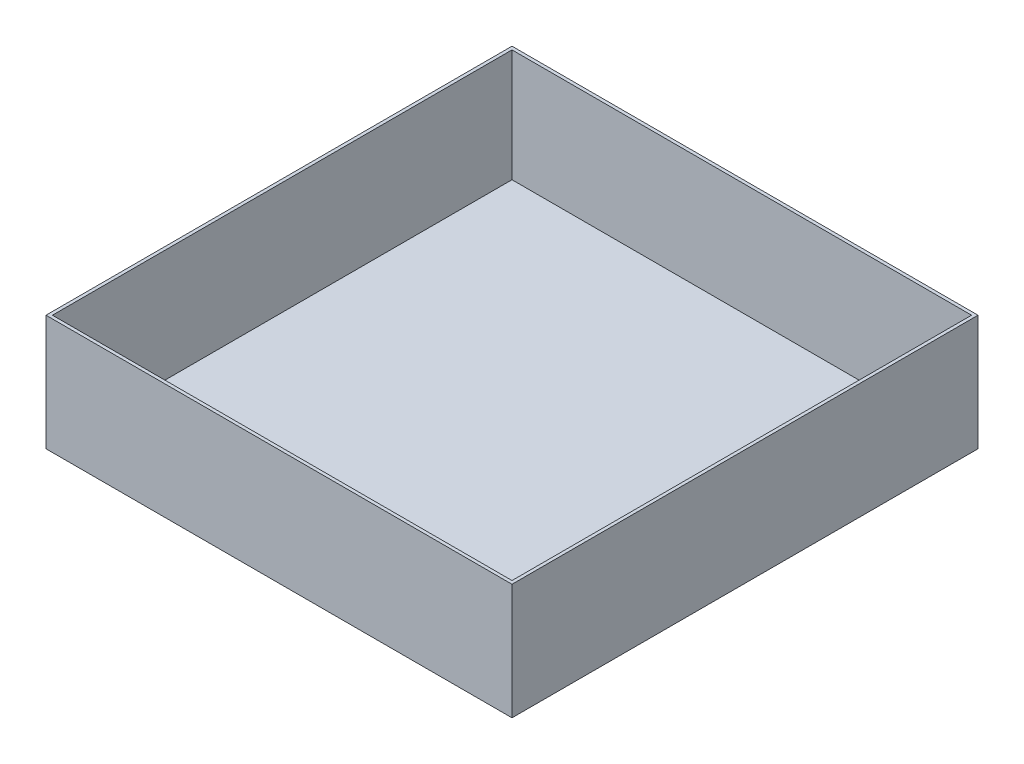
ISO-10303-21;
HEADER;
FILE_DESCRIPTION(('STEP AP214'),'2;1');
FILE_NAME('part.step','',(''),(''),'','','');
FILE_SCHEMA(('AUTOMOTIVE_DESIGN { 1 0 10303 214 1 1 1 1 }'));
ENDSEC;
DATA;
#1=APPLICATION_CONTEXT('core data for automotive mechanical design processes');
#2=APPLICATION_PROTOCOL_DEFINITION('international standard','automotive_design',2000,#1);
#3=PRODUCT_CONTEXT('',#1,'mechanical');
#4=PRODUCT('Part','Part','',(#3));
#5=PRODUCT_RELATED_PRODUCT_CATEGORY('part','',(#4));
#6=PRODUCT_DEFINITION_FORMATION('','',#4);
#7=PRODUCT_DEFINITION_CONTEXT('part definition',#1,'design');
#8=PRODUCT_DEFINITION('design','',#6,#7);
#9=PRODUCT_DEFINITION_SHAPE('','',#8);
#10=(LENGTH_UNIT() NAMED_UNIT(*) SI_UNIT(.MILLI.,.METRE.));
#11=(NAMED_UNIT(*) PLANE_ANGLE_UNIT() SI_UNIT($,.RADIAN.));
#12=(NAMED_UNIT(*) SI_UNIT($,.STERADIAN.) SOLID_ANGLE_UNIT());
#13=UNCERTAINTY_MEASURE_WITH_UNIT(LENGTH_MEASURE(1.E-05),#10,'distance_accuracy_value','');
#14=(GEOMETRIC_REPRESENTATION_CONTEXT(3) GLOBAL_UNCERTAINTY_ASSIGNED_CONTEXT((#13)) GLOBAL_UNIT_ASSIGNED_CONTEXT((#10,
#11,#12)) REPRESENTATION_CONTEXT('',''));
#15=CARTESIAN_POINT('',(0.,0.,0.));
#16=DIRECTION('',(0.,0.,1.));
#17=DIRECTION('',(1.,0.,0.));
#18=AXIS2_PLACEMENT_3D('',#15,#16,#17);
#19=CARTESIAN_POINT('',(0.,70.,0.));
#20=DIRECTION('',(0.,-1.,0.));
#21=DIRECTION('',(0.,0.,-1.));
#22=AXIS2_PLACEMENT_3D('',#19,#20,#21);
#23=PLANE('',#22);
#24=DIRECTION('',(0.,0.,-1.));
#25=VECTOR('',#24,1.);
#26=CARTESIAN_POINT('',(145.,70.,145.));
#27=LINE('',#26,#25);
#28=CARTESIAN_POINT('',(145.,70.,145.));
#29=VERTEX_POINT('',#28);
#30=CARTESIAN_POINT('',(145.,70.,-145.));
#31=VERTEX_POINT('',#30);
#32=EDGE_CURVE('E106',#29,#31,#27,.T.);
#33=ORIENTED_EDGE('',*,*,#32,.T.);
#34=DIRECTION('',(-1.,0.,0.));
#35=VECTOR('',#34,1.);
#36=CARTESIAN_POINT('',(-145.,70.,-145.));
#37=LINE('',#36,#35);
#38=CARTESIAN_POINT('',(-145.,70.,-145.));
#39=VERTEX_POINT('',#38);
#40=EDGE_CURVE('E155',#31,#39,#37,.T.);
#41=ORIENTED_EDGE('',*,*,#40,.T.);
#42=DIRECTION('',(0.,0.,1.));
#43=VECTOR('',#42,1.);
#44=CARTESIAN_POINT('',(-145.,70.,145.));
#45=LINE('',#44,#43);
#46=CARTESIAN_POINT('',(-145.,70.,145.));
#47=VERTEX_POINT('',#46);
#48=EDGE_CURVE('E157',#39,#47,#45,.T.);
#49=ORIENTED_EDGE('',*,*,#48,.T.);
#50=DIRECTION('',(1.,0.,0.));
#51=VECTOR('',#50,1.);
#52=CARTESIAN_POINT('',(-145.,70.,145.));
#53=LINE('',#52,#51);
#54=EDGE_CURVE('E110',#47,#29,#53,.T.);
#55=ORIENTED_EDGE('',*,*,#54,.T.);
#56=EDGE_LOOP('',(#33,#41,#49,#55));
#57=FACE_BOUND('',#56,.T.);
#58=DIRECTION('',(0.,0.,-1.));
#59=VECTOR('',#58,1.);
#60=CARTESIAN_POINT('',(143.,70.,143.));
#61=LINE('',#60,#59);
#62=CARTESIAN_POINT('',(143.,70.,143.));
#63=VERTEX_POINT('',#62);
#64=CARTESIAN_POINT('',(143.,70.,-143.));
#65=VERTEX_POINT('',#64);
#66=EDGE_CURVE('E129',#63,#65,#61,.T.);
#67=ORIENTED_EDGE('',*,*,#66,.F.);
#68=DIRECTION('',(1.,0.,0.));
#69=VECTOR('',#68,1.);
#70=CARTESIAN_POINT('',(-143.,70.,143.));
#71=LINE('',#70,#69);
#72=CARTESIAN_POINT('',(-143.,70.,143.));
#73=VERTEX_POINT('',#72);
#74=EDGE_CURVE('E136',#73,#63,#71,.T.);
#75=ORIENTED_EDGE('',*,*,#74,.F.);
#76=DIRECTION('',(0.,0.,1.));
#77=VECTOR('',#76,1.);
#78=CARTESIAN_POINT('',(-143.,70.,143.));
#79=LINE('',#78,#77);
#80=CARTESIAN_POINT('',(-143.,70.,-143.));
#81=VERTEX_POINT('',#80);
#82=EDGE_CURVE('E134',#81,#73,#79,.T.);
#83=ORIENTED_EDGE('',*,*,#82,.F.);
#84=DIRECTION('',(-1.,0.,0.));
#85=VECTOR('',#84,1.);
#86=CARTESIAN_POINT('',(-143.,70.,-143.));
#87=LINE('',#86,#85);
#88=EDGE_CURVE('E131',#65,#81,#87,.T.);
#89=ORIENTED_EDGE('',*,*,#88,.F.);
#90=EDGE_LOOP('',(#67,#75,#83,#89));
#91=FACE_BOUND('',#90,.T.);
#92=ADVANCED_FACE('F33',(#57,#91),#23,.F.);
#93=CARTESIAN_POINT('',(145.,70.,145.));
#94=DIRECTION('',(-1.,0.,0.));
#95=DIRECTION('',(0.,0.,1.));
#96=AXIS2_PLACEMENT_3D('',#93,#94,#95);
#97=PLANE('',#96);
#98=DIRECTION('',(0.,-1.,0.));
#99=VECTOR('',#98,1.);
#100=CARTESIAN_POINT('',(145.,70.,145.));
#101=LINE('',#100,#99);
#102=CARTESIAN_POINT('',(145.,-2.,145.));
#103=VERTEX_POINT('',#102);
#104=EDGE_CURVE('E100',#29,#103,#101,.T.);
#105=ORIENTED_EDGE('',*,*,#104,.T.);
#106=DIRECTION('',(0.,0.,1.));
#107=VECTOR('',#106,1.);
#108=CARTESIAN_POINT('',(145.,-2.,-145.));
#109=LINE('',#108,#107);
#110=CARTESIAN_POINT('',(145.,-2.,-145.));
#111=VERTEX_POINT('',#110);
#112=EDGE_CURVE('E104',#111,#103,#109,.T.);
#113=ORIENTED_EDGE('',*,*,#112,.F.);
#114=DIRECTION('',(0.,-1.,0.));
#115=VECTOR('',#114,1.);
#116=CARTESIAN_POINT('',(145.,70.,-145.));
#117=LINE('',#116,#115);
#118=EDGE_CURVE('E11',#31,#111,#117,.T.);
#119=ORIENTED_EDGE('',*,*,#118,.F.);
#120=ORIENTED_EDGE('',*,*,#32,.F.);
#121=EDGE_LOOP('',(#105,#113,#119,#120));
#122=FACE_BOUND('',#121,.T.);
#123=ADVANCED_FACE('F35',(#122),#97,.F.);
#124=CARTESIAN_POINT('',(-145.,70.,-145.));
#125=DIRECTION('',(0.,0.,1.));
#126=DIRECTION('',(1.,0.,0.));
#127=AXIS2_PLACEMENT_3D('',#124,#125,#126);
#128=PLANE('',#127);
#129=ORIENTED_EDGE('',*,*,#118,.T.);
#130=DIRECTION('',(1.,0.,0.));
#131=VECTOR('',#130,1.);
#132=CARTESIAN_POINT('',(-145.,-2.,-145.));
#133=LINE('',#132,#131);
#134=CARTESIAN_POINT('',(-145.,-2.,-145.));
#135=VERTEX_POINT('',#134);
#136=EDGE_CURVE('E124',#135,#111,#133,.T.);
#137=ORIENTED_EDGE('',*,*,#136,.F.);
#138=DIRECTION('',(0.,-1.,0.));
#139=VECTOR('',#138,1.);
#140=CARTESIAN_POINT('',(-145.,70.,-145.));
#141=LINE('',#140,#139);
#142=EDGE_CURVE('E41',#39,#135,#141,.T.);
#143=ORIENTED_EDGE('',*,*,#142,.F.);
#144=ORIENTED_EDGE('',*,*,#40,.F.);
#145=EDGE_LOOP('',(#129,#137,#143,#144));
#146=FACE_BOUND('',#145,.T.);
#147=ADVANCED_FACE('F165',(#146),#128,.F.);
#148=CARTESIAN_POINT('',(-145.,70.,145.));
#149=DIRECTION('',(1.,0.,0.));
#150=DIRECTION('',(0.,0.,-1.));
#151=AXIS2_PLACEMENT_3D('',#148,#149,#150);
#152=PLANE('',#151);
#153=ORIENTED_EDGE('',*,*,#142,.T.);
#154=DIRECTION('',(0.,0.,-1.));
#155=VECTOR('',#154,1.);
#156=CARTESIAN_POINT('',(-145.,-2.,-145.));
#157=LINE('',#156,#155);
#158=CARTESIAN_POINT('',(-145.,-2.,145.));
#159=VERTEX_POINT('',#158);
#160=EDGE_CURVE('E119',#159,#135,#157,.T.);
#161=ORIENTED_EDGE('',*,*,#160,.F.);
#162=DIRECTION('',(0.,-1.,0.));
#163=VECTOR('',#162,1.);
#164=CARTESIAN_POINT('',(-145.,70.,145.));
#165=LINE('',#164,#163);
#166=EDGE_CURVE('E109',#47,#159,#165,.T.);
#167=ORIENTED_EDGE('',*,*,#166,.F.);
#168=ORIENTED_EDGE('',*,*,#48,.F.);
#169=EDGE_LOOP('',(#153,#161,#167,#168));
#170=FACE_BOUND('',#169,.T.);
#171=ADVANCED_FACE('F163',(#170),#152,.F.);
#172=CARTESIAN_POINT('',(-145.,70.,145.));
#173=DIRECTION('',(0.,0.,-1.));
#174=DIRECTION('',(-1.,0.,0.));
#175=AXIS2_PLACEMENT_3D('',#172,#173,#174);
#176=PLANE('',#175);
#177=ORIENTED_EDGE('',*,*,#166,.T.);
#178=DIRECTION('',(-1.,0.,0.));
#179=VECTOR('',#178,1.);
#180=CARTESIAN_POINT('',(-145.,-2.,145.));
#181=LINE('',#180,#179);
#182=EDGE_CURVE('E113',#103,#159,#181,.T.);
#183=ORIENTED_EDGE('',*,*,#182,.F.);
#184=ORIENTED_EDGE('',*,*,#104,.F.);
#185=ORIENTED_EDGE('',*,*,#54,.F.);
#186=EDGE_LOOP('',(#177,#183,#184,#185));
#187=FACE_BOUND('',#186,.T.);
#188=ADVANCED_FACE('F114',(#187),#176,.F.);
#189=CARTESIAN_POINT('',(143.,70.,143.));
#190=DIRECTION('',(-1.,0.,0.));
#191=DIRECTION('',(0.,0.,1.));
#192=AXIS2_PLACEMENT_3D('',#189,#190,#191);
#193=PLANE('',#192);
#194=DIRECTION('',(0.,0.,-1.));
#195=VECTOR('',#194,1.);
#196=CARTESIAN_POINT('',(143.,0.,143.));
#197=LINE('',#196,#195);
#198=CARTESIAN_POINT('',(143.,0.,143.));
#199=VERTEX_POINT('',#198);
#200=CARTESIAN_POINT('',(143.,0.,-143.));
#201=VERTEX_POINT('',#200);
#202=EDGE_CURVE('E56',#199,#201,#197,.T.);
#203=ORIENTED_EDGE('',*,*,#202,.F.);
#204=DIRECTION('',(0.,-1.,0.));
#205=VECTOR('',#204,1.);
#206=CARTESIAN_POINT('',(143.,70.,143.));
#207=LINE('',#206,#205);
#208=EDGE_CURVE('E138',#63,#199,#207,.T.);
#209=ORIENTED_EDGE('',*,*,#208,.F.);
#210=ORIENTED_EDGE('',*,*,#66,.T.);
#211=DIRECTION('',(0.,-1.,0.));
#212=VECTOR('',#211,1.);
#213=CARTESIAN_POINT('',(143.,70.,-143.));
#214=LINE('',#213,#212);
#215=EDGE_CURVE('E152',#65,#201,#214,.T.);
#216=ORIENTED_EDGE('',*,*,#215,.T.);
#217=EDGE_LOOP('',(#203,#209,#210,#216));
#218=FACE_BOUND('',#217,.T.);
#219=ADVANCED_FACE('F175',(#218),#193,.T.);
#220=CARTESIAN_POINT('',(-143.,70.,-143.));
#221=DIRECTION('',(0.,0.,1.));
#222=DIRECTION('',(1.,0.,0.));
#223=AXIS2_PLACEMENT_3D('',#220,#221,#222);
#224=PLANE('',#223);
#225=DIRECTION('',(-1.,0.,0.));
#226=VECTOR('',#225,1.);
#227=CARTESIAN_POINT('',(-143.,0.,-143.));
#228=LINE('',#227,#226);
#229=CARTESIAN_POINT('',(-143.,0.,-143.));
#230=VERTEX_POINT('',#229);
#231=EDGE_CURVE('E140',#201,#230,#228,.T.);
#232=ORIENTED_EDGE('',*,*,#231,.F.);
#233=ORIENTED_EDGE('',*,*,#215,.F.);
#234=ORIENTED_EDGE('',*,*,#88,.T.);
#235=DIRECTION('',(0.,-1.,0.));
#236=VECTOR('',#235,1.);
#237=CARTESIAN_POINT('',(-143.,70.,-143.));
#238=LINE('',#237,#236);
#239=EDGE_CURVE('E150',#81,#230,#238,.T.);
#240=ORIENTED_EDGE('',*,*,#239,.T.);
#241=EDGE_LOOP('',(#232,#233,#234,#240));
#242=FACE_BOUND('',#241,.T.);
#243=ADVANCED_FACE('F177',(#242),#224,.T.);
#244=CARTESIAN_POINT('',(-143.,70.,143.));
#245=DIRECTION('',(1.,0.,0.));
#246=DIRECTION('',(0.,0.,-1.));
#247=AXIS2_PLACEMENT_3D('',#244,#245,#246);
#248=PLANE('',#247);
#249=DIRECTION('',(0.,0.,1.));
#250=VECTOR('',#249,1.);
#251=CARTESIAN_POINT('',(-143.,0.,143.));
#252=LINE('',#251,#250);
#253=CARTESIAN_POINT('',(-143.,0.,143.));
#254=VERTEX_POINT('',#253);
#255=EDGE_CURVE('E143',#230,#254,#252,.T.);
#256=ORIENTED_EDGE('',*,*,#255,.F.);
#257=ORIENTED_EDGE('',*,*,#239,.F.);
#258=ORIENTED_EDGE('',*,*,#82,.T.);
#259=DIRECTION('',(0.,-1.,0.));
#260=VECTOR('',#259,1.);
#261=CARTESIAN_POINT('',(-143.,70.,143.));
#262=LINE('',#261,#260);
#263=EDGE_CURVE('E48',#73,#254,#262,.T.);
#264=ORIENTED_EDGE('',*,*,#263,.T.);
#265=EDGE_LOOP('',(#256,#257,#258,#264));
#266=FACE_BOUND('',#265,.T.);
#267=ADVANCED_FACE('F184',(#266),#248,.T.);
#268=CARTESIAN_POINT('',(-143.,70.,143.));
#269=DIRECTION('',(0.,0.,-1.));
#270=DIRECTION('',(-1.,0.,0.));
#271=AXIS2_PLACEMENT_3D('',#268,#269,#270);
#272=PLANE('',#271);
#273=DIRECTION('',(1.,0.,0.));
#274=VECTOR('',#273,1.);
#275=CARTESIAN_POINT('',(-143.,0.,143.));
#276=LINE('',#275,#274);
#277=EDGE_CURVE('E132',#254,#199,#276,.T.);
#278=ORIENTED_EDGE('',*,*,#277,.F.);
#279=ORIENTED_EDGE('',*,*,#263,.F.);
#280=ORIENTED_EDGE('',*,*,#74,.T.);
#281=ORIENTED_EDGE('',*,*,#208,.T.);
#282=EDGE_LOOP('',(#278,#279,#280,#281));
#283=FACE_BOUND('',#282,.T.);
#284=ADVANCED_FACE('F182',(#283),#272,.T.);
#285=CARTESIAN_POINT('',(0.,0.,0.));
#286=DIRECTION('',(0.,1.,0.));
#287=DIRECTION('',(0.,0.,1.));
#288=AXIS2_PLACEMENT_3D('',#285,#286,#287);
#289=PLANE('',#288);
#290=ORIENTED_EDGE('',*,*,#255,.T.);
#291=ORIENTED_EDGE('',*,*,#277,.T.);
#292=ORIENTED_EDGE('',*,*,#202,.T.);
#293=ORIENTED_EDGE('',*,*,#231,.T.);
#294=EDGE_LOOP('',(#290,#291,#292,#293));
#295=FACE_BOUND('',#294,.T.);
#296=ADVANCED_FACE('F181',(#295),#289,.T.);
#297=CARTESIAN_POINT('',(0.,-2.,0.));
#298=DIRECTION('',(0.,1.,0.));
#299=DIRECTION('',(0.,0.,1.));
#300=AXIS2_PLACEMENT_3D('',#297,#298,#299);
#301=PLANE('',#300);
#302=ORIENTED_EDGE('',*,*,#112,.T.);
#303=ORIENTED_EDGE('',*,*,#182,.T.);
#304=ORIENTED_EDGE('',*,*,#160,.T.);
#305=ORIENTED_EDGE('',*,*,#136,.T.);
#306=EDGE_LOOP('',(#302,#303,#304,#305));
#307=FACE_BOUND('',#306,.T.);
#308=ADVANCED_FACE('F122',(#307),#301,.F.);
#309=CLOSED_SHELL('',(#92,#123,#147,#171,#188,#219,#243,#267,#284,#296,#308));
#310=MANIFOLD_SOLID_BREP('B2',#309);
#311=ADVANCED_BREP_SHAPE_REPRESENTATION('',(#18,#310),#14);
#312=SHAPE_DEFINITION_REPRESENTATION(#9,#311);
ENDSEC;
END-ISO-10303-21;
